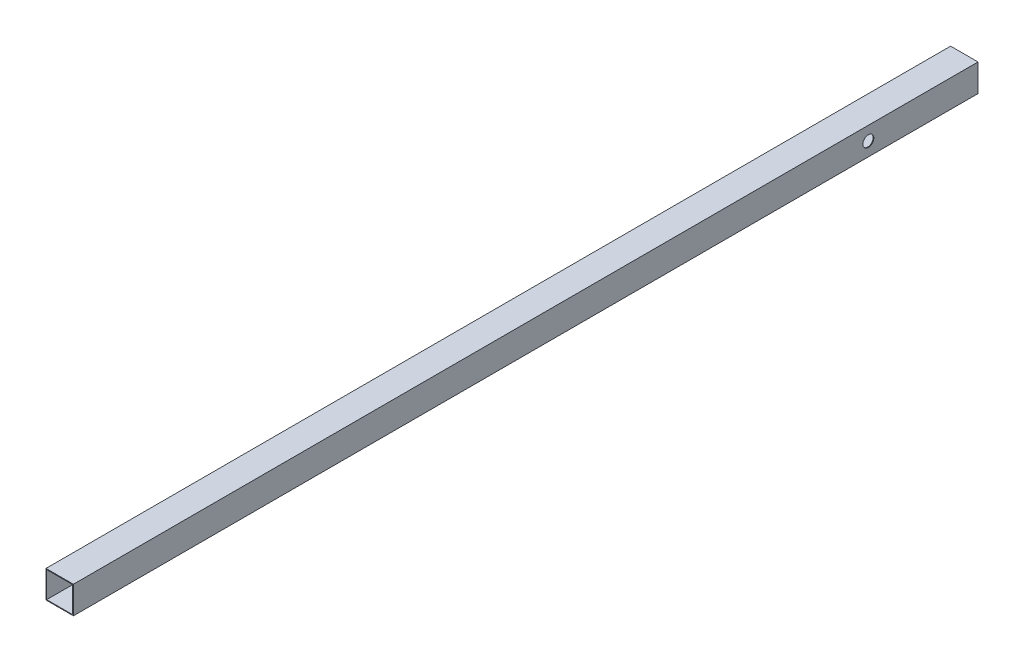
ISO-10303-21;
HEADER;
FILE_DESCRIPTION(('STEP AP214'),'2;1');
FILE_NAME('part.step','',(''),(''),'','','');
FILE_SCHEMA(('AUTOMOTIVE_DESIGN { 1 0 10303 214 1 1 1 1 }'));
ENDSEC;
DATA;
#1=APPLICATION_CONTEXT('core data for automotive mechanical design processes');
#2=APPLICATION_PROTOCOL_DEFINITION('international standard','automotive_design',2000,#1);
#3=PRODUCT_CONTEXT('',#1,'mechanical');
#4=PRODUCT('Part','Part','',(#3));
#5=PRODUCT_RELATED_PRODUCT_CATEGORY('part','',(#4));
#6=PRODUCT_DEFINITION_FORMATION('','',#4);
#7=PRODUCT_DEFINITION_CONTEXT('part definition',#1,'design');
#8=PRODUCT_DEFINITION('design','',#6,#7);
#9=PRODUCT_DEFINITION_SHAPE('','',#8);
#10=(LENGTH_UNIT() NAMED_UNIT(*) SI_UNIT(.MILLI.,.METRE.));
#11=(NAMED_UNIT(*) PLANE_ANGLE_UNIT() SI_UNIT($,.RADIAN.));
#12=(NAMED_UNIT(*) SI_UNIT($,.STERADIAN.) SOLID_ANGLE_UNIT());
#13=UNCERTAINTY_MEASURE_WITH_UNIT(LENGTH_MEASURE(1.E-05),#10,'distance_accuracy_value','');
#14=(GEOMETRIC_REPRESENTATION_CONTEXT(3) GLOBAL_UNCERTAINTY_ASSIGNED_CONTEXT((#13)) GLOBAL_UNIT_ASSIGNED_CONTEXT((#10,
#11,#12)) REPRESENTATION_CONTEXT('',''));
#15=CARTESIAN_POINT('',(0.,0.,0.));
#16=DIRECTION('',(0.,0.,1.));
#17=DIRECTION('',(1.,0.,0.));
#18=AXIS2_PLACEMENT_3D('',#15,#16,#17);
#19=CARTESIAN_POINT('',(10.,10.,660.));
#20=DIRECTION('',(-1.,0.,0.));
#21=DIRECTION('',(0.,-1.,0.));
#22=AXIS2_PLACEMENT_3D('',#19,#20,#21);
#23=PLANE('',#22);
#24=CARTESIAN_POINT('',(10.,0.,80.));
#25=DIRECTION('',(1.,0.,0.));
#26=DIRECTION('',(0.,1.,0.));
#27=AXIS2_PLACEMENT_3D('',#24,#25,#26);
#28=CIRCLE('',#27,3.99999999999999);
#29=CARTESIAN_POINT('',(10.,3.99999999999999,80.));
#30=VERTEX_POINT('',#29);
#31=EDGE_CURVE('E227',#30,#30,#28,.T.);
#32=ORIENTED_EDGE('',*,*,#31,.F.);
#33=EDGE_LOOP('',(#32));
#34=FACE_BOUND('',#33,.T.);
#35=DIRECTION('',(0.,1.,0.));
#36=VECTOR('',#35,1.);
#37=CARTESIAN_POINT('',(10.,10.,0.));
#38=LINE('',#37,#36);
#39=CARTESIAN_POINT('',(10.,-10.,0.));
#40=VERTEX_POINT('',#39);
#41=CARTESIAN_POINT('',(10.,10.,0.));
#42=VERTEX_POINT('',#41);
#43=EDGE_CURVE('E133',#40,#42,#38,.T.);
#44=ORIENTED_EDGE('',*,*,#43,.T.);
#45=DIRECTION('',(0.,0.,-1.));
#46=VECTOR('',#45,1.);
#47=CARTESIAN_POINT('',(10.,10.,660.));
#48=LINE('',#47,#46);
#49=CARTESIAN_POINT('',(10.,10.,660.));
#50=VERTEX_POINT('',#49);
#51=EDGE_CURVE('E11',#50,#42,#48,.T.);
#52=ORIENTED_EDGE('',*,*,#51,.F.);
#53=DIRECTION('',(0.,1.,0.));
#54=VECTOR('',#53,1.);
#55=CARTESIAN_POINT('',(10.,10.,660.));
#56=LINE('',#55,#54);
#57=CARTESIAN_POINT('',(10.,-10.,660.));
#58=VERTEX_POINT('',#57);
#59=EDGE_CURVE('E137',#58,#50,#56,.T.);
#60=ORIENTED_EDGE('',*,*,#59,.F.);
#61=DIRECTION('',(0.,0.,-1.));
#62=VECTOR('',#61,1.);
#63=CARTESIAN_POINT('',(10.,-10.,660.));
#64=LINE('',#63,#62);
#65=EDGE_CURVE('E147',#58,#40,#64,.T.);
#66=ORIENTED_EDGE('',*,*,#65,.T.);
#67=EDGE_LOOP('',(#44,#52,#60,#66));
#68=FACE_BOUND('',#67,.T.);
#69=ADVANCED_FACE('F32',(#34,#68),#23,.F.);
#70=CARTESIAN_POINT('',(-10.,10.,660.));
#71=DIRECTION('',(0.,-1.,0.));
#72=DIRECTION('',(0.,0.,-1.));
#73=AXIS2_PLACEMENT_3D('',#70,#71,#72);
#74=PLANE('',#73);
#75=DIRECTION('',(-1.,0.,0.));
#76=VECTOR('',#75,1.);
#77=CARTESIAN_POINT('',(-10.,10.,0.));
#78=LINE('',#77,#76);
#79=CARTESIAN_POINT('',(-10.,10.,0.));
#80=VERTEX_POINT('',#79);
#81=EDGE_CURVE('E150',#42,#80,#78,.T.);
#82=ORIENTED_EDGE('',*,*,#81,.T.);
#83=DIRECTION('',(0.,0.,-1.));
#84=VECTOR('',#83,1.);
#85=CARTESIAN_POINT('',(-10.,10.,660.));
#86=LINE('',#85,#84);
#87=CARTESIAN_POINT('',(-10.,10.,660.));
#88=VERTEX_POINT('',#87);
#89=EDGE_CURVE('E40',#88,#80,#86,.T.);
#90=ORIENTED_EDGE('',*,*,#89,.F.);
#91=DIRECTION('',(-1.,0.,0.));
#92=VECTOR('',#91,1.);
#93=CARTESIAN_POINT('',(-10.,10.,660.));
#94=LINE('',#93,#92);
#95=EDGE_CURVE('E140',#50,#88,#94,.T.);
#96=ORIENTED_EDGE('',*,*,#95,.F.);
#97=ORIENTED_EDGE('',*,*,#51,.T.);
#98=EDGE_LOOP('',(#82,#90,#96,#97));
#99=FACE_BOUND('',#98,.T.);
#100=ADVANCED_FACE('F179',(#99),#74,.F.);
#101=CARTESIAN_POINT('',(-10.,10.,660.));
#102=DIRECTION('',(1.,0.,0.));
#103=DIRECTION('',(0.,0.,-1.));
#104=AXIS2_PLACEMENT_3D('',#101,#102,#103);
#105=PLANE('',#104);
#106=CARTESIAN_POINT('',(-10.,0.,80.));
#107=DIRECTION('',(1.,0.,0.));
#108=DIRECTION('',(0.,1.,0.));
#109=AXIS2_PLACEMENT_3D('',#106,#107,#108);
#110=CIRCLE('',#109,3.99999999999999);
#111=CARTESIAN_POINT('',(-10.,3.99999999999999,80.));
#112=VERTEX_POINT('',#111);
#113=EDGE_CURVE('E222',#112,#112,#110,.T.);
#114=ORIENTED_EDGE('',*,*,#113,.T.);
#115=EDGE_LOOP('',(#114));
#116=FACE_BOUND('',#115,.T.);
#117=DIRECTION('',(0.,-1.,0.));
#118=VECTOR('',#117,1.);
#119=CARTESIAN_POINT('',(-10.,10.,0.));
#120=LINE('',#119,#118);
#121=CARTESIAN_POINT('',(-10.,-10.,0.));
#122=VERTEX_POINT('',#121);
#123=EDGE_CURVE('E152',#80,#122,#120,.T.);
#124=ORIENTED_EDGE('',*,*,#123,.T.);
#125=DIRECTION('',(0.,0.,-1.));
#126=VECTOR('',#125,1.);
#127=CARTESIAN_POINT('',(-10.,-10.,660.));
#128=LINE('',#127,#126);
#129=CARTESIAN_POINT('',(-10.,-10.,660.));
#130=VERTEX_POINT('',#129);
#131=EDGE_CURVE('E157',#130,#122,#128,.T.);
#132=ORIENTED_EDGE('',*,*,#131,.F.);
#133=DIRECTION('',(0.,-1.,0.));
#134=VECTOR('',#133,1.);
#135=CARTESIAN_POINT('',(-10.,10.,660.));
#136=LINE('',#135,#134);
#137=EDGE_CURVE('E143',#88,#130,#136,.T.);
#138=ORIENTED_EDGE('',*,*,#137,.F.);
#139=ORIENTED_EDGE('',*,*,#89,.T.);
#140=EDGE_LOOP('',(#124,#132,#138,#139));
#141=FACE_BOUND('',#140,.T.);
#142=ADVANCED_FACE('F165',(#116,#141),#105,.F.);
#143=CARTESIAN_POINT('',(-10.,-10.,660.));
#144=DIRECTION('',(0.,1.,0.));
#145=DIRECTION('',(0.,0.,1.));
#146=AXIS2_PLACEMENT_3D('',#143,#144,#145);
#147=PLANE('',#146);
#148=DIRECTION('',(1.,0.,0.));
#149=VECTOR('',#148,1.);
#150=CARTESIAN_POINT('',(-10.,-10.,0.));
#151=LINE('',#150,#149);
#152=EDGE_CURVE('E141',#122,#40,#151,.T.);
#153=ORIENTED_EDGE('',*,*,#152,.T.);
#154=ORIENTED_EDGE('',*,*,#65,.F.);
#155=DIRECTION('',(1.,0.,0.));
#156=VECTOR('',#155,1.);
#157=CARTESIAN_POINT('',(-10.,-10.,660.));
#158=LINE('',#157,#156);
#159=EDGE_CURVE('E145',#130,#58,#158,.T.);
#160=ORIENTED_EDGE('',*,*,#159,.F.);
#161=ORIENTED_EDGE('',*,*,#131,.T.);
#162=EDGE_LOOP('',(#153,#154,#160,#161));
#163=FACE_BOUND('',#162,.T.);
#164=ADVANCED_FACE('F174',(#163),#147,.F.);
#165=CARTESIAN_POINT('',(0.,0.,660.));
#166=DIRECTION('',(0.,0.,1.));
#167=DIRECTION('',(1.,0.,0.));
#168=AXIS2_PLACEMENT_3D('',#165,#166,#167);
#169=PLANE('',#168);
#170=DIRECTION('',(0.,1.,0.));
#171=VECTOR('',#170,1.);
#172=CARTESIAN_POINT('',(-9.5,9.5,660.));
#173=LINE('',#172,#171);
#174=CARTESIAN_POINT('',(-9.5,-9.5,660.));
#175=VERTEX_POINT('',#174);
#176=CARTESIAN_POINT('',(-9.5,9.5,660.));
#177=VERTEX_POINT('',#176);
#178=EDGE_CURVE('E99',#175,#177,#173,.T.);
#179=ORIENTED_EDGE('',*,*,#178,.T.);
#180=DIRECTION('',(1.,0.,0.));
#181=VECTOR('',#180,1.);
#182=CARTESIAN_POINT('',(9.5,9.5,660.));
#183=LINE('',#182,#181);
#184=CARTESIAN_POINT('',(9.5,9.5,660.));
#185=VERTEX_POINT('',#184);
#186=EDGE_CURVE('E108',#177,#185,#183,.T.);
#187=ORIENTED_EDGE('',*,*,#186,.T.);
#188=DIRECTION('',(0.,-1.,0.));
#189=VECTOR('',#188,1.);
#190=CARTESIAN_POINT('',(9.5,9.5,660.));
#191=LINE('',#190,#189);
#192=CARTESIAN_POINT('',(9.5,-9.5,660.));
#193=VERTEX_POINT('',#192);
#194=EDGE_CURVE('E47',#185,#193,#191,.T.);
#195=ORIENTED_EDGE('',*,*,#194,.T.);
#196=DIRECTION('',(-1.,0.,0.));
#197=VECTOR('',#196,1.);
#198=CARTESIAN_POINT('',(9.5,-9.5,660.));
#199=LINE('',#198,#197);
#200=EDGE_CURVE('E105',#193,#175,#199,.T.);
#201=ORIENTED_EDGE('',*,*,#200,.T.);
#202=EDGE_LOOP('',(#179,#187,#195,#201));
#203=FACE_BOUND('',#202,.T.);
#204=ORIENTED_EDGE('',*,*,#59,.T.);
#205=ORIENTED_EDGE('',*,*,#95,.T.);
#206=ORIENTED_EDGE('',*,*,#137,.T.);
#207=ORIENTED_EDGE('',*,*,#159,.T.);
#208=EDGE_LOOP('',(#204,#205,#206,#207));
#209=FACE_BOUND('',#208,.T.);
#210=ADVANCED_FACE('F112',(#203,#209),#169,.T.);
#211=CARTESIAN_POINT('',(0.,0.,0.));
#212=DIRECTION('',(0.,0.,1.));
#213=DIRECTION('',(1.,0.,0.));
#214=AXIS2_PLACEMENT_3D('',#211,#212,#213);
#215=PLANE('',#214);
#216=DIRECTION('',(1.,0.,0.));
#217=VECTOR('',#216,1.);
#218=CARTESIAN_POINT('',(9.5,9.5,0.));
#219=LINE('',#218,#217);
#220=CARTESIAN_POINT('',(-9.5,9.5,0.));
#221=VERTEX_POINT('',#220);
#222=CARTESIAN_POINT('',(9.5,9.5,0.));
#223=VERTEX_POINT('',#222);
#224=EDGE_CURVE('E127',#221,#223,#219,.T.);
#225=ORIENTED_EDGE('',*,*,#224,.F.);
#226=DIRECTION('',(0.,1.,0.));
#227=VECTOR('',#226,1.);
#228=CARTESIAN_POINT('',(-9.5,9.5,0.));
#229=LINE('',#228,#227);
#230=CARTESIAN_POINT('',(-9.5,-9.5,0.));
#231=VERTEX_POINT('',#230);
#232=EDGE_CURVE('E55',#231,#221,#229,.T.);
#233=ORIENTED_EDGE('',*,*,#232,.F.);
#234=DIRECTION('',(-1.,0.,0.));
#235=VECTOR('',#234,1.);
#236=CARTESIAN_POINT('',(9.5,-9.5,0.));
#237=LINE('',#236,#235);
#238=CARTESIAN_POINT('',(9.5,-9.5,0.));
#239=VERTEX_POINT('',#238);
#240=EDGE_CURVE('E115',#239,#231,#237,.T.);
#241=ORIENTED_EDGE('',*,*,#240,.F.);
#242=DIRECTION('',(0.,-1.,0.));
#243=VECTOR('',#242,1.);
#244=CARTESIAN_POINT('',(9.5,9.5,0.));
#245=LINE('',#244,#243);
#246=EDGE_CURVE('E118',#223,#239,#245,.T.);
#247=ORIENTED_EDGE('',*,*,#246,.F.);
#248=EDGE_LOOP('',(#225,#233,#241,#247));
#249=FACE_BOUND('',#248,.T.);
#250=ORIENTED_EDGE('',*,*,#43,.F.);
#251=ORIENTED_EDGE('',*,*,#152,.F.);
#252=ORIENTED_EDGE('',*,*,#123,.F.);
#253=ORIENTED_EDGE('',*,*,#81,.F.);
#254=EDGE_LOOP('',(#250,#251,#252,#253));
#255=FACE_BOUND('',#254,.T.);
#256=ADVANCED_FACE('F171',(#249,#255),#215,.F.);
#257=CARTESIAN_POINT('',(-9.5,9.5,660.));
#258=DIRECTION('',(-1.,0.,0.));
#259=DIRECTION('',(0.,-1.,0.));
#260=AXIS2_PLACEMENT_3D('',#257,#258,#259);
#261=PLANE('',#260);
#262=CARTESIAN_POINT('',(-9.5,0.,80.));
#263=DIRECTION('',(-1.,0.,0.));
#264=DIRECTION('',(0.,-1.,0.));
#265=AXIS2_PLACEMENT_3D('',#262,#263,#264);
#266=CIRCLE('',#265,3.99999999999999);
#267=CARTESIAN_POINT('',(-9.5,-3.99999999999999,80.));
#268=VERTEX_POINT('',#267);
#269=EDGE_CURVE('E121',#268,#268,#266,.T.);
#270=ORIENTED_EDGE('',*,*,#269,.T.);
#271=EDGE_LOOP('',(#270));
#272=FACE_BOUND('',#271,.T.);
#273=ORIENTED_EDGE('',*,*,#232,.T.);
#274=DIRECTION('',(0.,0.,-1.));
#275=VECTOR('',#274,1.);
#276=CARTESIAN_POINT('',(-9.5,9.5,660.));
#277=LINE('',#276,#275);
#278=EDGE_CURVE('E95',#177,#221,#277,.T.);
#279=ORIENTED_EDGE('',*,*,#278,.F.);
#280=ORIENTED_EDGE('',*,*,#178,.F.);
#281=DIRECTION('',(0.,0.,-1.));
#282=VECTOR('',#281,1.);
#283=CARTESIAN_POINT('',(-9.5,-9.5,660.));
#284=LINE('',#283,#282);
#285=EDGE_CURVE('E131',#175,#231,#284,.T.);
#286=ORIENTED_EDGE('',*,*,#285,.T.);
#287=EDGE_LOOP('',(#273,#279,#280,#286));
#288=FACE_BOUND('',#287,.T.);
#289=ADVANCED_FACE('F97',(#272,#288),#261,.F.);
#290=CARTESIAN_POINT('',(9.5,-9.5,660.));
#291=DIRECTION('',(0.,-1.,0.));
#292=DIRECTION('',(0.,0.,-1.));
#293=AXIS2_PLACEMENT_3D('',#290,#291,#292);
#294=PLANE('',#293);
#295=ORIENTED_EDGE('',*,*,#240,.T.);
#296=ORIENTED_EDGE('',*,*,#285,.F.);
#297=ORIENTED_EDGE('',*,*,#200,.F.);
#298=DIRECTION('',(0.,0.,-1.));
#299=VECTOR('',#298,1.);
#300=CARTESIAN_POINT('',(9.5,-9.5,660.));
#301=LINE('',#300,#299);
#302=EDGE_CURVE('E134',#193,#239,#301,.T.);
#303=ORIENTED_EDGE('',*,*,#302,.T.);
#304=EDGE_LOOP('',(#295,#296,#297,#303));
#305=FACE_BOUND('',#304,.T.);
#306=ADVANCED_FACE('F200',(#305),#294,.F.);
#307=CARTESIAN_POINT('',(9.5,9.5,660.));
#308=DIRECTION('',(1.,0.,0.));
#309=DIRECTION('',(0.,1.,0.));
#310=AXIS2_PLACEMENT_3D('',#307,#308,#309);
#311=PLANE('',#310);
#312=CARTESIAN_POINT('',(9.5,0.,80.));
#313=DIRECTION('',(1.,0.,0.));
#314=DIRECTION('',(0.,1.,0.));
#315=AXIS2_PLACEMENT_3D('',#312,#313,#314);
#316=CIRCLE('',#315,3.99999999999999);
#317=CARTESIAN_POINT('',(9.5,3.99999999999999,80.));
#318=VERTEX_POINT('',#317);
#319=EDGE_CURVE('E35',#318,#318,#316,.T.);
#320=ORIENTED_EDGE('',*,*,#319,.T.);
#321=EDGE_LOOP('',(#320));
#322=FACE_BOUND('',#321,.T.);
#323=ORIENTED_EDGE('',*,*,#246,.T.);
#324=ORIENTED_EDGE('',*,*,#302,.F.);
#325=ORIENTED_EDGE('',*,*,#194,.F.);
#326=DIRECTION('',(0.,0.,-1.));
#327=VECTOR('',#326,1.);
#328=CARTESIAN_POINT('',(9.5,9.5,660.));
#329=LINE('',#328,#327);
#330=EDGE_CURVE('E104',#185,#223,#329,.T.);
#331=ORIENTED_EDGE('',*,*,#330,.T.);
#332=EDGE_LOOP('',(#323,#324,#325,#331));
#333=FACE_BOUND('',#332,.T.);
#334=ADVANCED_FACE('F205',(#322,#333),#311,.F.);
#335=CARTESIAN_POINT('',(9.5,9.5,660.));
#336=DIRECTION('',(0.,1.,0.));
#337=DIRECTION('',(0.,0.,1.));
#338=AXIS2_PLACEMENT_3D('',#335,#336,#337);
#339=PLANE('',#338);
#340=ORIENTED_EDGE('',*,*,#224,.T.);
#341=ORIENTED_EDGE('',*,*,#330,.F.);
#342=ORIENTED_EDGE('',*,*,#186,.F.);
#343=ORIENTED_EDGE('',*,*,#278,.T.);
#344=EDGE_LOOP('',(#340,#341,#342,#343));
#345=FACE_BOUND('',#344,.T.);
#346=ADVANCED_FACE('F109',(#345),#339,.F.);
#347=CARTESIAN_POINT('',(-10.,0.,80.));
#348=DIRECTION('',(1.,0.,0.));
#349=DIRECTION('',(0.,1.,0.));
#350=AXIS2_PLACEMENT_3D('',#347,#348,#349);
#351=CYLINDRICAL_SURFACE('',#350,3.99999999999999);
#352=ORIENTED_EDGE('',*,*,#31,.T.);
#353=EDGE_LOOP('',(#352));
#354=FACE_BOUND('',#353,.T.);
#355=ORIENTED_EDGE('',*,*,#319,.F.);
#356=EDGE_LOOP('',(#355));
#357=FACE_BOUND('',#356,.T.);
#358=ADVANCED_FACE('F204',(#354,#357),#351,.F.);
#359=ORIENTED_EDGE('',*,*,#113,.F.);
#360=EDGE_LOOP('',(#359));
#361=FACE_BOUND('',#360,.T.);
#362=ORIENTED_EDGE('',*,*,#269,.F.);
#363=EDGE_LOOP('',(#362));
#364=FACE_BOUND('',#363,.T.);
#365=ADVANCED_FACE('F212',(#361,#364),#351,.F.);
#366=CLOSED_SHELL('',(#69,#100,#142,#164,#210,#256,#289,#306,#334,#346,#358,#365));
#367=MANIFOLD_SOLID_BREP('B2',#366);
#368=ADVANCED_BREP_SHAPE_REPRESENTATION('',(#18,#367),#14);
#369=SHAPE_DEFINITION_REPRESENTATION(#9,#368);
ENDSEC;
END-ISO-10303-21;
